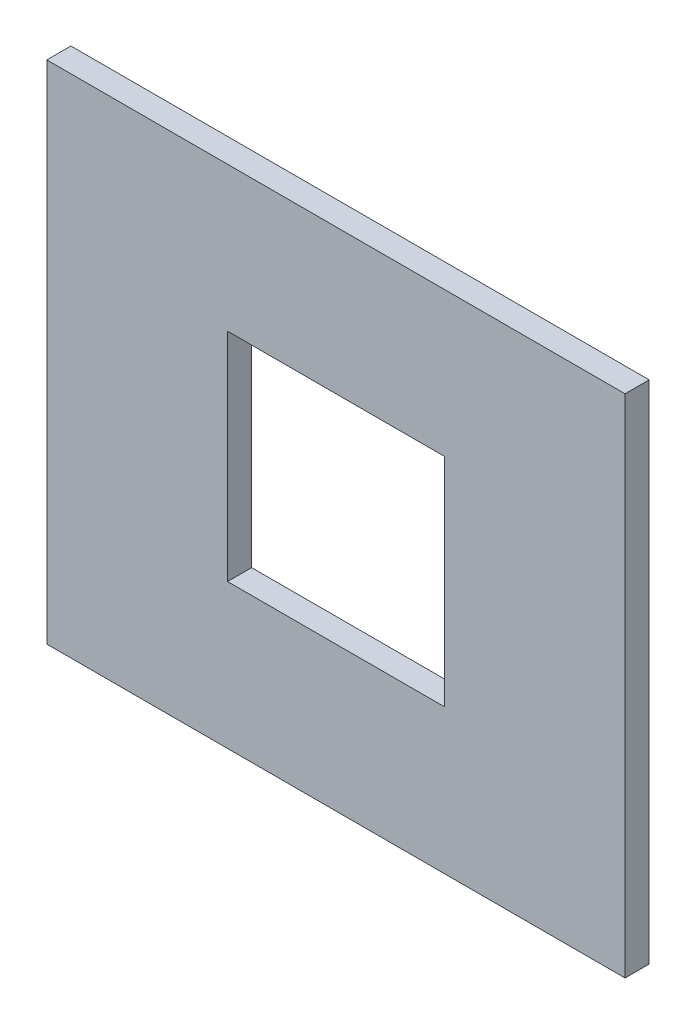
ISO-10303-21;
HEADER;
FILE_DESCRIPTION(('STEP AP214'),'2;1');
FILE_NAME('part.step','',(''),(''),'','','');
FILE_SCHEMA(('AUTOMOTIVE_DESIGN { 1 0 10303 214 1 1 1 1 }'));
ENDSEC;
DATA;
#1=APPLICATION_CONTEXT('core data for automotive mechanical design processes');
#2=APPLICATION_PROTOCOL_DEFINITION('international standard','automotive_design',2000,#1);
#3=PRODUCT_CONTEXT('',#1,'mechanical');
#4=PRODUCT('Part','Part','',(#3));
#5=PRODUCT_RELATED_PRODUCT_CATEGORY('part','',(#4));
#6=PRODUCT_DEFINITION_FORMATION('','',#4);
#7=PRODUCT_DEFINITION_CONTEXT('part definition',#1,'design');
#8=PRODUCT_DEFINITION('design','',#6,#7);
#9=PRODUCT_DEFINITION_SHAPE('','',#8);
#10=(LENGTH_UNIT() NAMED_UNIT(*) SI_UNIT(.MILLI.,.METRE.));
#11=(NAMED_UNIT(*) PLANE_ANGLE_UNIT() SI_UNIT($,.RADIAN.));
#12=(NAMED_UNIT(*) SI_UNIT($,.STERADIAN.) SOLID_ANGLE_UNIT());
#13=UNCERTAINTY_MEASURE_WITH_UNIT(LENGTH_MEASURE(1.E-05),#10,'distance_accuracy_value','');
#14=(GEOMETRIC_REPRESENTATION_CONTEXT(3) GLOBAL_UNCERTAINTY_ASSIGNED_CONTEXT((#13)) GLOBAL_UNIT_ASSIGNED_CONTEXT((#10,
#11,#12)) REPRESENTATION_CONTEXT('',''));
#15=CARTESIAN_POINT('',(0.,0.,0.));
#16=DIRECTION('',(0.,0.,1.));
#17=DIRECTION('',(1.,0.,0.));
#18=AXIS2_PLACEMENT_3D('',#15,#16,#17);
#19=CARTESIAN_POINT('',(-152.4,-133.35,12.7));
#20=DIRECTION('',(0.,0.,1.));
#21=DIRECTION('',(1.,0.,0.));
#22=AXIS2_PLACEMENT_3D('',#19,#20,#21);
#23=PLANE('',#22);
#24=DIRECTION('',(0.,-1.,0.));
#25=VECTOR('',#24,1.);
#26=CARTESIAN_POINT('',(-152.4,133.35,12.7));
#27=LINE('',#26,#25);
#28=CARTESIAN_POINT('',(-152.4,133.35,12.7));
#29=VERTEX_POINT('',#28);
#30=CARTESIAN_POINT('',(-152.4,-133.35,12.7));
#31=VERTEX_POINT('',#30);
#32=EDGE_CURVE('E142',#29,#31,#27,.T.);
#33=ORIENTED_EDGE('',*,*,#32,.T.);
#34=DIRECTION('',(1.,0.,0.));
#35=VECTOR('',#34,1.);
#36=CARTESIAN_POINT('',(-152.4,-133.35,12.7));
#37=LINE('',#36,#35);
#38=CARTESIAN_POINT('',(152.4,-133.35,12.7));
#39=VERTEX_POINT('',#38);
#40=EDGE_CURVE('E145',#31,#39,#37,.T.);
#41=ORIENTED_EDGE('',*,*,#40,.T.);
#42=DIRECTION('',(0.,1.,0.));
#43=VECTOR('',#42,1.);
#44=CARTESIAN_POINT('',(152.4,133.35,12.7));
#45=LINE('',#44,#43);
#46=CARTESIAN_POINT('',(152.4,133.35,12.7));
#47=VERTEX_POINT('',#46);
#48=EDGE_CURVE('E147',#39,#47,#45,.T.);
#49=ORIENTED_EDGE('',*,*,#48,.T.);
#50=DIRECTION('',(-1.,0.,0.));
#51=VECTOR('',#50,1.);
#52=CARTESIAN_POINT('',(-152.4,133.35,12.7));
#53=LINE('',#52,#51);
#54=EDGE_CURVE('E149',#47,#29,#53,.T.);
#55=ORIENTED_EDGE('',*,*,#54,.T.);
#56=EDGE_LOOP('',(#33,#41,#49,#55));
#57=FACE_BOUND('',#56,.T.);
#58=DIRECTION('',(1.,0.,0.));
#59=VECTOR('',#58,1.);
#60=CARTESIAN_POINT('',(-57.15,-57.15,12.7));
#61=LINE('',#60,#59);
#62=CARTESIAN_POINT('',(-57.15,-57.15,12.7));
#63=VERTEX_POINT('',#62);
#64=CARTESIAN_POINT('',(57.15,-57.15,12.7));
#65=VERTEX_POINT('',#64);
#66=EDGE_CURVE('E124',#63,#65,#61,.T.);
#67=ORIENTED_EDGE('',*,*,#66,.F.);
#68=DIRECTION('',(0.,-1.,0.));
#69=VECTOR('',#68,1.);
#70=CARTESIAN_POINT('',(-57.15,57.15,12.7));
#71=LINE('',#70,#69);
#72=CARTESIAN_POINT('',(-57.15,57.15,12.7));
#73=VERTEX_POINT('',#72);
#74=EDGE_CURVE('E113',#73,#63,#71,.T.);
#75=ORIENTED_EDGE('',*,*,#74,.F.);
#76=DIRECTION('',(-1.,0.,0.));
#77=VECTOR('',#76,1.);
#78=CARTESIAN_POINT('',(-57.15,57.15,12.7));
#79=LINE('',#78,#77);
#80=CARTESIAN_POINT('',(57.15,57.1500000000001,12.7));
#81=VERTEX_POINT('',#80);
#82=EDGE_CURVE('E128',#81,#73,#79,.T.);
#83=ORIENTED_EDGE('',*,*,#82,.F.);
#84=DIRECTION('',(0.,1.,0.));
#85=VECTOR('',#84,1.);
#86=CARTESIAN_POINT('',(57.15,57.15,12.7));
#87=LINE('',#86,#85);
#88=EDGE_CURVE('E126',#65,#81,#87,.T.);
#89=ORIENTED_EDGE('',*,*,#88,.F.);
#90=EDGE_LOOP('',(#67,#75,#83,#89));
#91=FACE_BOUND('',#90,.T.);
#92=ADVANCED_FACE('F33',(#57,#91),#23,.T.);
#93=CARTESIAN_POINT('',(-152.4,-133.35,0.));
#94=DIRECTION('',(0.,0.,1.));
#95=DIRECTION('',(1.,0.,0.));
#96=AXIS2_PLACEMENT_3D('',#93,#94,#95);
#97=PLANE('',#96);
#98=DIRECTION('',(0.,-1.,0.));
#99=VECTOR('',#98,1.);
#100=CARTESIAN_POINT('',(-152.4,133.35,0.));
#101=LINE('',#100,#99);
#102=CARTESIAN_POINT('',(-152.4,133.35,0.));
#103=VERTEX_POINT('',#102);
#104=CARTESIAN_POINT('',(-152.4,-133.35,0.));
#105=VERTEX_POINT('',#104);
#106=EDGE_CURVE('E114',#103,#105,#101,.T.);
#107=ORIENTED_EDGE('',*,*,#106,.F.);
#108=DIRECTION('',(-1.,0.,0.));
#109=VECTOR('',#108,1.);
#110=CARTESIAN_POINT('',(-152.4,133.35,0.));
#111=LINE('',#110,#109);
#112=CARTESIAN_POINT('',(152.4,133.35,0.));
#113=VERTEX_POINT('',#112);
#114=EDGE_CURVE('E140',#113,#103,#111,.T.);
#115=ORIENTED_EDGE('',*,*,#114,.F.);
#116=DIRECTION('',(0.,1.,0.));
#117=VECTOR('',#116,1.);
#118=CARTESIAN_POINT('',(152.4,133.35,0.));
#119=LINE('',#118,#117);
#120=CARTESIAN_POINT('',(152.4,-133.35,0.));
#121=VERTEX_POINT('',#120);
#122=EDGE_CURVE('E138',#121,#113,#119,.T.);
#123=ORIENTED_EDGE('',*,*,#122,.F.);
#124=DIRECTION('',(1.,0.,0.));
#125=VECTOR('',#124,1.);
#126=CARTESIAN_POINT('',(-152.4,-133.35,0.));
#127=LINE('',#126,#125);
#128=EDGE_CURVE('E136',#105,#121,#127,.T.);
#129=ORIENTED_EDGE('',*,*,#128,.F.);
#130=EDGE_LOOP('',(#107,#115,#123,#129));
#131=FACE_BOUND('',#130,.T.);
#132=DIRECTION('',(0.,-1.,0.));
#133=VECTOR('',#132,1.);
#134=CARTESIAN_POINT('',(-57.15,57.15,0.));
#135=LINE('',#134,#133);
#136=CARTESIAN_POINT('',(-57.15,57.15,0.));
#137=VERTEX_POINT('',#136);
#138=CARTESIAN_POINT('',(-57.15,-57.15,0.));
#139=VERTEX_POINT('',#138);
#140=EDGE_CURVE('E56',#137,#139,#135,.T.);
#141=ORIENTED_EDGE('',*,*,#140,.T.);
#142=DIRECTION('',(1.,0.,0.));
#143=VECTOR('',#142,1.);
#144=CARTESIAN_POINT('',(-57.15,-57.15,0.));
#145=LINE('',#144,#143);
#146=CARTESIAN_POINT('',(57.15,-57.15,0.));
#147=VERTEX_POINT('',#146);
#148=EDGE_CURVE('E100',#139,#147,#145,.T.);
#149=ORIENTED_EDGE('',*,*,#148,.T.);
#150=DIRECTION('',(0.,1.,0.));
#151=VECTOR('',#150,1.);
#152=CARTESIAN_POINT('',(57.15,57.15,0.));
#153=LINE('',#152,#151);
#154=CARTESIAN_POINT('',(57.15,57.15,0.));
#155=VERTEX_POINT('',#154);
#156=EDGE_CURVE('E109',#147,#155,#153,.T.);
#157=ORIENTED_EDGE('',*,*,#156,.T.);
#158=DIRECTION('',(-1.,0.,0.));
#159=VECTOR('',#158,1.);
#160=CARTESIAN_POINT('',(-57.15,57.15,0.));
#161=LINE('',#160,#159);
#162=EDGE_CURVE('E118',#155,#137,#161,.T.);
#163=ORIENTED_EDGE('',*,*,#162,.T.);
#164=EDGE_LOOP('',(#141,#149,#157,#163));
#165=FACE_BOUND('',#164,.T.);
#166=ADVANCED_FACE('F117',(#131,#165),#97,.F.);
#167=CARTESIAN_POINT('',(-152.4,133.35,12.7));
#168=DIRECTION('',(1.,0.,0.));
#169=DIRECTION('',(0.,0.,-1.));
#170=AXIS2_PLACEMENT_3D('',#167,#168,#169);
#171=PLANE('',#170);
#172=ORIENTED_EDGE('',*,*,#106,.T.);
#173=DIRECTION('',(0.,0.,-1.));
#174=VECTOR('',#173,1.);
#175=CARTESIAN_POINT('',(-152.4,-133.35,12.7));
#176=LINE('',#175,#174);
#177=EDGE_CURVE('E11',#31,#105,#176,.T.);
#178=ORIENTED_EDGE('',*,*,#177,.F.);
#179=ORIENTED_EDGE('',*,*,#32,.F.);
#180=DIRECTION('',(0.,0.,-1.));
#181=VECTOR('',#180,1.);
#182=CARTESIAN_POINT('',(-152.4,133.35,12.7));
#183=LINE('',#182,#181);
#184=EDGE_CURVE('E151',#29,#103,#183,.T.);
#185=ORIENTED_EDGE('',*,*,#184,.T.);
#186=EDGE_LOOP('',(#172,#178,#179,#185));
#187=FACE_BOUND('',#186,.T.);
#188=ADVANCED_FACE('F35',(#187),#171,.F.);
#189=CARTESIAN_POINT('',(-152.4,-133.35,12.7));
#190=DIRECTION('',(0.,1.,0.));
#191=DIRECTION('',(0.,0.,1.));
#192=AXIS2_PLACEMENT_3D('',#189,#190,#191);
#193=PLANE('',#192);
#194=ORIENTED_EDGE('',*,*,#128,.T.);
#195=DIRECTION('',(0.,0.,-1.));
#196=VECTOR('',#195,1.);
#197=CARTESIAN_POINT('',(152.4,-133.35,12.7));
#198=LINE('',#197,#196);
#199=EDGE_CURVE('E41',#39,#121,#198,.T.);
#200=ORIENTED_EDGE('',*,*,#199,.F.);
#201=ORIENTED_EDGE('',*,*,#40,.F.);
#202=ORIENTED_EDGE('',*,*,#177,.T.);
#203=EDGE_LOOP('',(#194,#200,#201,#202));
#204=FACE_BOUND('',#203,.T.);
#205=ADVANCED_FACE('F176',(#204),#193,.F.);
#206=CARTESIAN_POINT('',(152.4,133.35,12.7));
#207=DIRECTION('',(-1.,0.,0.));
#208=DIRECTION('',(0.,0.,1.));
#209=AXIS2_PLACEMENT_3D('',#206,#207,#208);
#210=PLANE('',#209);
#211=ORIENTED_EDGE('',*,*,#122,.T.);
#212=DIRECTION('',(0.,0.,-1.));
#213=VECTOR('',#212,1.);
#214=CARTESIAN_POINT('',(152.4,133.35,12.7));
#215=LINE('',#214,#213);
#216=EDGE_CURVE('E154',#47,#113,#215,.T.);
#217=ORIENTED_EDGE('',*,*,#216,.F.);
#218=ORIENTED_EDGE('',*,*,#48,.F.);
#219=ORIENTED_EDGE('',*,*,#199,.T.);
#220=EDGE_LOOP('',(#211,#217,#218,#219));
#221=FACE_BOUND('',#220,.T.);
#222=ADVANCED_FACE('F161',(#221),#210,.F.);
#223=CARTESIAN_POINT('',(-152.4,133.35,12.7));
#224=DIRECTION('',(0.,-1.,0.));
#225=DIRECTION('',(0.,0.,-1.));
#226=AXIS2_PLACEMENT_3D('',#223,#224,#225);
#227=PLANE('',#226);
#228=ORIENTED_EDGE('',*,*,#114,.T.);
#229=ORIENTED_EDGE('',*,*,#184,.F.);
#230=ORIENTED_EDGE('',*,*,#54,.F.);
#231=ORIENTED_EDGE('',*,*,#216,.T.);
#232=EDGE_LOOP('',(#228,#229,#230,#231));
#233=FACE_BOUND('',#232,.T.);
#234=ADVANCED_FACE('F169',(#233),#227,.F.);
#235=CARTESIAN_POINT('',(-57.15,57.15,12.7));
#236=DIRECTION('',(1.,0.,0.));
#237=DIRECTION('',(0.,0.,-1.));
#238=AXIS2_PLACEMENT_3D('',#235,#236,#237);
#239=PLANE('',#238);
#240=ORIENTED_EDGE('',*,*,#140,.F.);
#241=DIRECTION('',(0.,0.,-1.));
#242=VECTOR('',#241,1.);
#243=CARTESIAN_POINT('',(-57.15,57.15,12.7));
#244=LINE('',#243,#242);
#245=EDGE_CURVE('E130',#73,#137,#244,.T.);
#246=ORIENTED_EDGE('',*,*,#245,.F.);
#247=ORIENTED_EDGE('',*,*,#74,.T.);
#248=DIRECTION('',(0.,0.,-1.));
#249=VECTOR('',#248,1.);
#250=CARTESIAN_POINT('',(-57.15,-57.15,12.7));
#251=LINE('',#250,#249);
#252=EDGE_CURVE('E102',#63,#139,#251,.T.);
#253=ORIENTED_EDGE('',*,*,#252,.T.);
#254=EDGE_LOOP('',(#240,#246,#247,#253));
#255=FACE_BOUND('',#254,.T.);
#256=ADVANCED_FACE('F111',(#255),#239,.T.);
#257=CARTESIAN_POINT('',(-57.15,-57.15,12.7));
#258=DIRECTION('',(0.,1.,0.));
#259=DIRECTION('',(-1.,0.,0.));
#260=AXIS2_PLACEMENT_3D('',#257,#258,#259);
#261=PLANE('',#260);
#262=ORIENTED_EDGE('',*,*,#148,.F.);
#263=ORIENTED_EDGE('',*,*,#252,.F.);
#264=ORIENTED_EDGE('',*,*,#66,.T.);
#265=DIRECTION('',(0.,0.,-1.));
#266=VECTOR('',#265,1.);
#267=CARTESIAN_POINT('',(57.15,-57.15,12.7));
#268=LINE('',#267,#266);
#269=EDGE_CURVE('E105',#65,#147,#268,.T.);
#270=ORIENTED_EDGE('',*,*,#269,.T.);
#271=EDGE_LOOP('',(#262,#263,#264,#270));
#272=FACE_BOUND('',#271,.T.);
#273=ADVANCED_FACE('F101',(#272),#261,.T.);
#274=CARTESIAN_POINT('',(57.15,57.15,12.7));
#275=DIRECTION('',(-1.,0.,0.));
#276=DIRECTION('',(0.,0.,1.));
#277=AXIS2_PLACEMENT_3D('',#274,#275,#276);
#278=PLANE('',#277);
#279=ORIENTED_EDGE('',*,*,#156,.F.);
#280=ORIENTED_EDGE('',*,*,#269,.F.);
#281=ORIENTED_EDGE('',*,*,#88,.T.);
#282=DIRECTION('',(0.,0.,-1.));
#283=VECTOR('',#282,1.);
#284=CARTESIAN_POINT('',(57.15,57.15,12.7));
#285=LINE('',#284,#283);
#286=EDGE_CURVE('E48',#81,#155,#285,.T.);
#287=ORIENTED_EDGE('',*,*,#286,.T.);
#288=EDGE_LOOP('',(#279,#280,#281,#287));
#289=FACE_BOUND('',#288,.T.);
#290=ADVANCED_FACE('F194',(#289),#278,.T.);
#291=CARTESIAN_POINT('',(-57.15,57.15,12.7));
#292=DIRECTION('',(0.,-1.,0.));
#293=DIRECTION('',(1.,0.,0.));
#294=AXIS2_PLACEMENT_3D('',#291,#292,#293);
#295=PLANE('',#294);
#296=ORIENTED_EDGE('',*,*,#162,.F.);
#297=ORIENTED_EDGE('',*,*,#286,.F.);
#298=ORIENTED_EDGE('',*,*,#82,.T.);
#299=ORIENTED_EDGE('',*,*,#245,.T.);
#300=EDGE_LOOP('',(#296,#297,#298,#299));
#301=FACE_BOUND('',#300,.T.);
#302=ADVANCED_FACE('F199',(#301),#295,.T.);
#303=CLOSED_SHELL('',(#92,#166,#188,#205,#222,#234,#256,#273,#290,#302));
#304=MANIFOLD_SOLID_BREP('B2',#303);
#305=ADVANCED_BREP_SHAPE_REPRESENTATION('',(#18,#304),#14);
#306=SHAPE_DEFINITION_REPRESENTATION(#9,#305);
ENDSEC;
END-ISO-10303-21;
